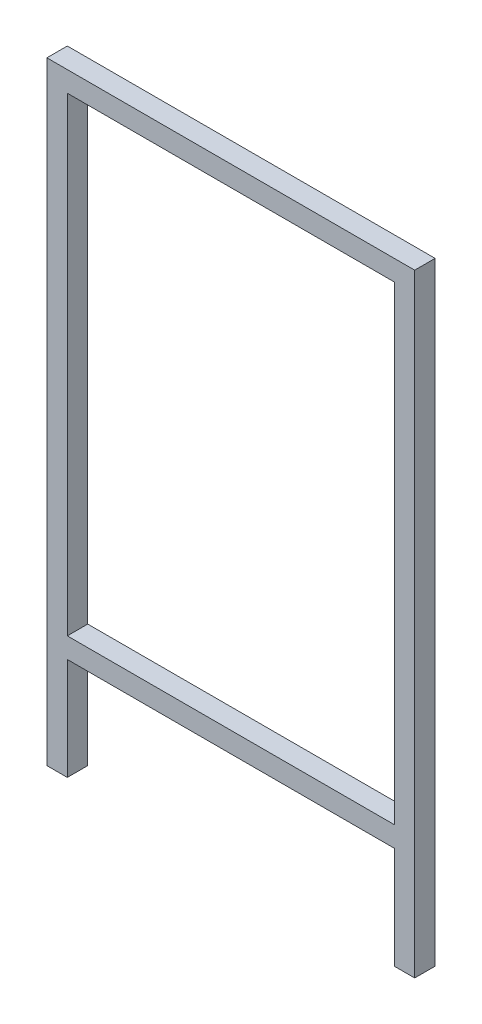
ISO-10303-21;
HEADER;
FILE_DESCRIPTION(('STEP AP214'),'2;1');
FILE_NAME('part.step','',(''),(''),'','','');
FILE_SCHEMA(('AUTOMOTIVE_DESIGN { 1 0 10303 214 1 1 1 1 }'));
ENDSEC;
DATA;
#1=APPLICATION_CONTEXT('core data for automotive mechanical design processes');
#2=APPLICATION_PROTOCOL_DEFINITION('international standard','automotive_design',2000,#1);
#3=PRODUCT_CONTEXT('',#1,'mechanical');
#4=PRODUCT('Part','Part','',(#3));
#5=PRODUCT_RELATED_PRODUCT_CATEGORY('part','',(#4));
#6=PRODUCT_DEFINITION_FORMATION('','',#4);
#7=PRODUCT_DEFINITION_CONTEXT('part definition',#1,'design');
#8=PRODUCT_DEFINITION('design','',#6,#7);
#9=PRODUCT_DEFINITION_SHAPE('','',#8);
#10=(LENGTH_UNIT() NAMED_UNIT(*) SI_UNIT(.MILLI.,.METRE.));
#11=(NAMED_UNIT(*) PLANE_ANGLE_UNIT() SI_UNIT($,.RADIAN.));
#12=(NAMED_UNIT(*) SI_UNIT($,.STERADIAN.) SOLID_ANGLE_UNIT());
#13=UNCERTAINTY_MEASURE_WITH_UNIT(LENGTH_MEASURE(1.E-05),#10,'distance_accuracy_value','');
#14=(GEOMETRIC_REPRESENTATION_CONTEXT(3) GLOBAL_UNCERTAINTY_ASSIGNED_CONTEXT((#13)) GLOBAL_UNIT_ASSIGNED_CONTEXT((#10,
#11,#12)) REPRESENTATION_CONTEXT('',''));
#15=CARTESIAN_POINT('',(0.,0.,0.));
#16=DIRECTION('',(0.,0.,1.));
#17=DIRECTION('',(1.,0.,0.));
#18=AXIS2_PLACEMENT_3D('',#15,#16,#17);
#19=CARTESIAN_POINT('',(0.,0.,10.));
#20=DIRECTION('',(0.,0.,-1.));
#21=DIRECTION('',(-1.,0.,0.));
#22=AXIS2_PLACEMENT_3D('',#19,#20,#21);
#23=PLANE('',#22);
#24=DIRECTION('',(1.,0.,0.));
#25=VECTOR('',#24,1.);
#26=CARTESIAN_POINT('',(-160.,-600.,10.));
#27=LINE('',#26,#25);
#28=CARTESIAN_POINT('',(-180.,-600.,10.));
#29=VERTEX_POINT('',#28);
#30=CARTESIAN_POINT('',(-160.,-600.,10.));
#31=VERTEX_POINT('',#30);
#32=EDGE_CURVE('E158',#29,#31,#27,.T.);
#33=ORIENTED_EDGE('',*,*,#32,.T.);
#34=DIRECTION('',(0.,1.,0.));
#35=VECTOR('',#34,1.);
#36=CARTESIAN_POINT('',(-160.,-500.,10.));
#37=LINE('',#36,#35);
#38=CARTESIAN_POINT('',(-160.,-500.,10.));
#39=VERTEX_POINT('',#38);
#40=EDGE_CURVE('E161',#31,#39,#37,.T.);
#41=ORIENTED_EDGE('',*,*,#40,.T.);
#42=DIRECTION('',(1.,0.,0.));
#43=VECTOR('',#42,1.);
#44=CARTESIAN_POINT('',(160.,-500.,10.));
#45=LINE('',#44,#43);
#46=CARTESIAN_POINT('',(160.,-500.,10.));
#47=VERTEX_POINT('',#46);
#48=EDGE_CURVE('E164',#39,#47,#45,.T.);
#49=ORIENTED_EDGE('',*,*,#48,.T.);
#50=DIRECTION('',(0.,-1.,0.));
#51=VECTOR('',#50,1.);
#52=CARTESIAN_POINT('',(160.,-600.,10.));
#53=LINE('',#52,#51);
#54=CARTESIAN_POINT('',(160.,-600.,10.));
#55=VERTEX_POINT('',#54);
#56=EDGE_CURVE('E166',#47,#55,#53,.T.);
#57=ORIENTED_EDGE('',*,*,#56,.T.);
#58=DIRECTION('',(1.,0.,0.));
#59=VECTOR('',#58,1.);
#60=CARTESIAN_POINT('',(180.,-600.,10.));
#61=LINE('',#60,#59);
#62=CARTESIAN_POINT('',(180.,-600.,10.));
#63=VERTEX_POINT('',#62);
#64=EDGE_CURVE('E168',#55,#63,#61,.T.);
#65=ORIENTED_EDGE('',*,*,#64,.T.);
#66=DIRECTION('',(0.,1.,0.));
#67=VECTOR('',#66,1.);
#68=CARTESIAN_POINT('',(180.,0.,10.));
#69=LINE('',#68,#67);
#70=CARTESIAN_POINT('',(180.,0.,10.));
#71=VERTEX_POINT('',#70);
#72=EDGE_CURVE('E170',#63,#71,#69,.T.);
#73=ORIENTED_EDGE('',*,*,#72,.T.);
#74=DIRECTION('',(-1.,0.,0.));
#75=VECTOR('',#74,1.);
#76=CARTESIAN_POINT('',(-180.,0.,10.));
#77=LINE('',#76,#75);
#78=CARTESIAN_POINT('',(-180.,0.,10.));
#79=VERTEX_POINT('',#78);
#80=EDGE_CURVE('E172',#71,#79,#77,.T.);
#81=ORIENTED_EDGE('',*,*,#80,.T.);
#82=DIRECTION('',(0.,-1.,0.));
#83=VECTOR('',#82,1.);
#84=CARTESIAN_POINT('',(-180.,-600.,10.));
#85=LINE('',#84,#83);
#86=EDGE_CURVE('E174',#79,#29,#85,.T.);
#87=ORIENTED_EDGE('',*,*,#86,.T.);
#88=EDGE_LOOP('',(#33,#41,#49,#57,#65,#73,#81,#87));
#89=FACE_BOUND('',#88,.T.);
#90=DIRECTION('',(0.,-1.,0.));
#91=VECTOR('',#90,1.);
#92=CARTESIAN_POINT('',(-160.,-20.,10.));
#93=LINE('',#92,#91);
#94=CARTESIAN_POINT('',(-160.,-20.,10.));
#95=VERTEX_POINT('',#94);
#96=CARTESIAN_POINT('',(-160.,-480.,10.));
#97=VERTEX_POINT('',#96);
#98=EDGE_CURVE('E122',#95,#97,#93,.T.);
#99=ORIENTED_EDGE('',*,*,#98,.F.);
#100=DIRECTION('',(-1.,0.,0.));
#101=VECTOR('',#100,1.);
#102=CARTESIAN_POINT('',(-160.,-20.,10.));
#103=LINE('',#102,#101);
#104=CARTESIAN_POINT('',(160.,-20.,10.));
#105=VERTEX_POINT('',#104);
#106=EDGE_CURVE('E144',#105,#95,#103,.T.);
#107=ORIENTED_EDGE('',*,*,#106,.F.);
#108=DIRECTION('',(0.,1.,0.));
#109=VECTOR('',#108,1.);
#110=CARTESIAN_POINT('',(160.,-20.,10.));
#111=LINE('',#110,#109);
#112=CARTESIAN_POINT('',(160.,-480.,10.));
#113=VERTEX_POINT('',#112);
#114=EDGE_CURVE('E142',#113,#105,#111,.T.);
#115=ORIENTED_EDGE('',*,*,#114,.F.);
#116=DIRECTION('',(1.,0.,0.));
#117=VECTOR('',#116,1.);
#118=CARTESIAN_POINT('',(-160.,-480.,10.));
#119=LINE('',#118,#117);
#120=EDGE_CURVE('E130',#97,#113,#119,.T.);
#121=ORIENTED_EDGE('',*,*,#120,.F.);
#122=EDGE_LOOP('',(#99,#107,#115,#121));
#123=FACE_BOUND('',#122,.T.);
#124=ADVANCED_FACE('F33',(#89,#123),#23,.F.);
#125=CARTESIAN_POINT('',(0.,0.,-10.));
#126=DIRECTION('',(0.,0.,-1.));
#127=DIRECTION('',(-1.,0.,0.));
#128=AXIS2_PLACEMENT_3D('',#125,#126,#127);
#129=PLANE('',#128);
#130=DIRECTION('',(1.,0.,0.));
#131=VECTOR('',#130,1.);
#132=CARTESIAN_POINT('',(-160.,-600.,-10.));
#133=LINE('',#132,#131);
#134=CARTESIAN_POINT('',(-180.,-600.,-10.));
#135=VERTEX_POINT('',#134);
#136=CARTESIAN_POINT('',(-160.,-600.,-10.));
#137=VERTEX_POINT('',#136);
#138=EDGE_CURVE('E138',#135,#137,#133,.T.);
#139=ORIENTED_EDGE('',*,*,#138,.F.);
#140=DIRECTION('',(0.,-1.,0.));
#141=VECTOR('',#140,1.);
#142=CARTESIAN_POINT('',(-180.,-600.,-10.));
#143=LINE('',#142,#141);
#144=CARTESIAN_POINT('',(-180.,0.,-10.));
#145=VERTEX_POINT('',#144);
#146=EDGE_CURVE('E162',#145,#135,#143,.T.);
#147=ORIENTED_EDGE('',*,*,#146,.F.);
#148=DIRECTION('',(-1.,0.,0.));
#149=VECTOR('',#148,1.);
#150=CARTESIAN_POINT('',(-180.,0.,-10.));
#151=LINE('',#150,#149);
#152=CARTESIAN_POINT('',(180.,0.,-10.));
#153=VERTEX_POINT('',#152);
#154=EDGE_CURVE('E189',#153,#145,#151,.T.);
#155=ORIENTED_EDGE('',*,*,#154,.F.);
#156=DIRECTION('',(0.,1.,0.));
#157=VECTOR('',#156,1.);
#158=CARTESIAN_POINT('',(180.,0.,-10.));
#159=LINE('',#158,#157);
#160=CARTESIAN_POINT('',(180.,-600.,-10.));
#161=VERTEX_POINT('',#160);
#162=EDGE_CURVE('E187',#161,#153,#159,.T.);
#163=ORIENTED_EDGE('',*,*,#162,.F.);
#164=DIRECTION('',(1.,0.,0.));
#165=VECTOR('',#164,1.);
#166=CARTESIAN_POINT('',(180.,-600.,-10.));
#167=LINE('',#166,#165);
#168=CARTESIAN_POINT('',(160.,-600.,-10.));
#169=VERTEX_POINT('',#168);
#170=EDGE_CURVE('E185',#169,#161,#167,.T.);
#171=ORIENTED_EDGE('',*,*,#170,.F.);
#172=DIRECTION('',(0.,-1.,0.));
#173=VECTOR('',#172,1.);
#174=CARTESIAN_POINT('',(160.,-600.,-10.));
#175=LINE('',#174,#173);
#176=CARTESIAN_POINT('',(160.,-500.,-10.));
#177=VERTEX_POINT('',#176);
#178=EDGE_CURVE('E183',#177,#169,#175,.T.);
#179=ORIENTED_EDGE('',*,*,#178,.F.);
#180=DIRECTION('',(1.,0.,0.));
#181=VECTOR('',#180,1.);
#182=CARTESIAN_POINT('',(160.,-500.,-10.));
#183=LINE('',#182,#181);
#184=CARTESIAN_POINT('',(-160.,-500.,-10.));
#185=VERTEX_POINT('',#184);
#186=EDGE_CURVE('E181',#185,#177,#183,.T.);
#187=ORIENTED_EDGE('',*,*,#186,.F.);
#188=DIRECTION('',(0.,1.,0.));
#189=VECTOR('',#188,1.);
#190=CARTESIAN_POINT('',(-160.,-500.,-10.));
#191=LINE('',#190,#189);
#192=EDGE_CURVE('E179',#137,#185,#191,.T.);
#193=ORIENTED_EDGE('',*,*,#192,.F.);
#194=EDGE_LOOP('',(#139,#147,#155,#163,#171,#179,#187,#193));
#195=FACE_BOUND('',#194,.T.);
#196=DIRECTION('',(-1.,0.,0.));
#197=VECTOR('',#196,1.);
#198=CARTESIAN_POINT('',(-160.,-20.,-10.));
#199=LINE('',#198,#197);
#200=CARTESIAN_POINT('',(160.,-20.,-10.));
#201=VERTEX_POINT('',#200);
#202=CARTESIAN_POINT('',(-160.,-20.,-10.));
#203=VERTEX_POINT('',#202);
#204=EDGE_CURVE('E131',#201,#203,#199,.T.);
#205=ORIENTED_EDGE('',*,*,#204,.T.);
#206=DIRECTION('',(0.,-1.,0.));
#207=VECTOR('',#206,1.);
#208=CARTESIAN_POINT('',(-160.,-20.,-10.));
#209=LINE('',#208,#207);
#210=CARTESIAN_POINT('',(-160.,-480.,-10.));
#211=VERTEX_POINT('',#210);
#212=EDGE_CURVE('E56',#203,#211,#209,.T.);
#213=ORIENTED_EDGE('',*,*,#212,.T.);
#214=DIRECTION('',(1.,0.,0.));
#215=VECTOR('',#214,1.);
#216=CARTESIAN_POINT('',(-160.,-480.,-10.));
#217=LINE('',#216,#215);
#218=CARTESIAN_POINT('',(160.,-480.,-10.));
#219=VERTEX_POINT('',#218);
#220=EDGE_CURVE('E137',#211,#219,#217,.T.);
#221=ORIENTED_EDGE('',*,*,#220,.T.);
#222=DIRECTION('',(0.,1.,0.));
#223=VECTOR('',#222,1.);
#224=CARTESIAN_POINT('',(160.,-20.,-10.));
#225=LINE('',#224,#223);
#226=EDGE_CURVE('E150',#219,#201,#225,.T.);
#227=ORIENTED_EDGE('',*,*,#226,.T.);
#228=EDGE_LOOP('',(#205,#213,#221,#227));
#229=FACE_BOUND('',#228,.T.);
#230=ADVANCED_FACE('F219',(#195,#229),#129,.T.);
#231=CARTESIAN_POINT('',(-160.,-600.,10.));
#232=DIRECTION('',(0.,1.,0.));
#233=DIRECTION('',(0.,0.,1.));
#234=AXIS2_PLACEMENT_3D('',#231,#232,#233);
#235=PLANE('',#234);
#236=ORIENTED_EDGE('',*,*,#138,.T.);
#237=DIRECTION('',(0.,0.,-1.));
#238=VECTOR('',#237,1.);
#239=CARTESIAN_POINT('',(-160.,-600.,10.));
#240=LINE('',#239,#238);
#241=EDGE_CURVE('E11',#31,#137,#240,.T.);
#242=ORIENTED_EDGE('',*,*,#241,.F.);
#243=ORIENTED_EDGE('',*,*,#32,.F.);
#244=DIRECTION('',(0.,0.,-1.));
#245=VECTOR('',#244,1.);
#246=CARTESIAN_POINT('',(-180.,-600.,10.));
#247=LINE('',#246,#245);
#248=EDGE_CURVE('E176',#29,#135,#247,.T.);
#249=ORIENTED_EDGE('',*,*,#248,.T.);
#250=EDGE_LOOP('',(#236,#242,#243,#249));
#251=FACE_BOUND('',#250,.T.);
#252=ADVANCED_FACE('F35',(#251),#235,.F.);
#253=CARTESIAN_POINT('',(-160.,-500.,10.));
#254=DIRECTION('',(-1.,0.,0.));
#255=DIRECTION('',(0.,-1.,0.));
#256=AXIS2_PLACEMENT_3D('',#253,#254,#255);
#257=PLANE('',#256);
#258=ORIENTED_EDGE('',*,*,#192,.T.);
#259=DIRECTION('',(0.,0.,-1.));
#260=VECTOR('',#259,1.);
#261=CARTESIAN_POINT('',(-160.,-500.,10.));
#262=LINE('',#261,#260);
#263=EDGE_CURVE('E41',#39,#185,#262,.T.);
#264=ORIENTED_EDGE('',*,*,#263,.F.);
#265=ORIENTED_EDGE('',*,*,#40,.F.);
#266=ORIENTED_EDGE('',*,*,#241,.T.);
#267=EDGE_LOOP('',(#258,#264,#265,#266));
#268=FACE_BOUND('',#267,.T.);
#269=ADVANCED_FACE('F236',(#268),#257,.F.);
#270=CARTESIAN_POINT('',(160.,-500.,10.));
#271=DIRECTION('',(0.,1.,0.));
#272=DIRECTION('',(0.,0.,1.));
#273=AXIS2_PLACEMENT_3D('',#270,#271,#272);
#274=PLANE('',#273);
#275=ORIENTED_EDGE('',*,*,#186,.T.);
#276=DIRECTION('',(0.,0.,-1.));
#277=VECTOR('',#276,1.);
#278=CARTESIAN_POINT('',(160.,-500.,10.));
#279=LINE('',#278,#277);
#280=EDGE_CURVE('E206',#47,#177,#279,.T.);
#281=ORIENTED_EDGE('',*,*,#280,.F.);
#282=ORIENTED_EDGE('',*,*,#48,.F.);
#283=ORIENTED_EDGE('',*,*,#263,.T.);
#284=EDGE_LOOP('',(#275,#281,#282,#283));
#285=FACE_BOUND('',#284,.T.);
#286=ADVANCED_FACE('F213',(#285),#274,.F.);
#287=CARTESIAN_POINT('',(160.,-600.,10.));
#288=DIRECTION('',(1.,0.,0.));
#289=DIRECTION('',(0.,1.,0.));
#290=AXIS2_PLACEMENT_3D('',#287,#288,#289);
#291=PLANE('',#290);
#292=ORIENTED_EDGE('',*,*,#178,.T.);
#293=DIRECTION('',(0.,0.,-1.));
#294=VECTOR('',#293,1.);
#295=CARTESIAN_POINT('',(160.,-600.,10.));
#296=LINE('',#295,#294);
#297=EDGE_CURVE('E203',#55,#169,#296,.T.);
#298=ORIENTED_EDGE('',*,*,#297,.F.);
#299=ORIENTED_EDGE('',*,*,#56,.F.);
#300=ORIENTED_EDGE('',*,*,#280,.T.);
#301=EDGE_LOOP('',(#292,#298,#299,#300));
#302=FACE_BOUND('',#301,.T.);
#303=ADVANCED_FACE('F225',(#302),#291,.F.);
#304=CARTESIAN_POINT('',(180.,-600.,10.));
#305=DIRECTION('',(0.,1.,0.));
#306=DIRECTION('',(0.,0.,1.));
#307=AXIS2_PLACEMENT_3D('',#304,#305,#306);
#308=PLANE('',#307);
#309=ORIENTED_EDGE('',*,*,#170,.T.);
#310=DIRECTION('',(0.,0.,-1.));
#311=VECTOR('',#310,1.);
#312=CARTESIAN_POINT('',(180.,-600.,10.));
#313=LINE('',#312,#311);
#314=EDGE_CURVE('E200',#63,#161,#313,.T.);
#315=ORIENTED_EDGE('',*,*,#314,.F.);
#316=ORIENTED_EDGE('',*,*,#64,.F.);
#317=ORIENTED_EDGE('',*,*,#297,.T.);
#318=EDGE_LOOP('',(#309,#315,#316,#317));
#319=FACE_BOUND('',#318,.T.);
#320=ADVANCED_FACE('F229',(#319),#308,.F.);
#321=CARTESIAN_POINT('',(180.,0.,10.));
#322=DIRECTION('',(-1.,0.,0.));
#323=DIRECTION('',(0.,0.,1.));
#324=AXIS2_PLACEMENT_3D('',#321,#322,#323);
#325=PLANE('',#324);
#326=ORIENTED_EDGE('',*,*,#162,.T.);
#327=DIRECTION('',(0.,0.,-1.));
#328=VECTOR('',#327,1.);
#329=CARTESIAN_POINT('',(180.,0.,10.));
#330=LINE('',#329,#328);
#331=EDGE_CURVE('E197',#71,#153,#330,.T.);
#332=ORIENTED_EDGE('',*,*,#331,.F.);
#333=ORIENTED_EDGE('',*,*,#72,.F.);
#334=ORIENTED_EDGE('',*,*,#314,.T.);
#335=EDGE_LOOP('',(#326,#332,#333,#334));
#336=FACE_BOUND('',#335,.T.);
#337=ADVANCED_FACE('F249',(#336),#325,.F.);
#338=CARTESIAN_POINT('',(-180.,0.,10.));
#339=DIRECTION('',(0.,-1.,0.));
#340=DIRECTION('',(0.,0.,-1.));
#341=AXIS2_PLACEMENT_3D('',#338,#339,#340);
#342=PLANE('',#341);
#343=ORIENTED_EDGE('',*,*,#154,.T.);
#344=DIRECTION('',(0.,0.,-1.));
#345=VECTOR('',#344,1.);
#346=CARTESIAN_POINT('',(-180.,0.,10.));
#347=LINE('',#346,#345);
#348=EDGE_CURVE('E194',#79,#145,#347,.T.);
#349=ORIENTED_EDGE('',*,*,#348,.F.);
#350=ORIENTED_EDGE('',*,*,#80,.F.);
#351=ORIENTED_EDGE('',*,*,#331,.T.);
#352=EDGE_LOOP('',(#343,#349,#350,#351));
#353=FACE_BOUND('',#352,.T.);
#354=ADVANCED_FACE('F247',(#353),#342,.F.);
#355=CARTESIAN_POINT('',(-180.,-600.,10.));
#356=DIRECTION('',(1.,0.,0.));
#357=DIRECTION('',(0.,1.,0.));
#358=AXIS2_PLACEMENT_3D('',#355,#356,#357);
#359=PLANE('',#358);
#360=ORIENTED_EDGE('',*,*,#146,.T.);
#361=ORIENTED_EDGE('',*,*,#248,.F.);
#362=ORIENTED_EDGE('',*,*,#86,.F.);
#363=ORIENTED_EDGE('',*,*,#348,.T.);
#364=EDGE_LOOP('',(#360,#361,#362,#363));
#365=FACE_BOUND('',#364,.T.);
#366=ADVANCED_FACE('F242',(#365),#359,.F.);
#367=CARTESIAN_POINT('',(-160.,-20.,10.));
#368=DIRECTION('',(1.,0.,0.));
#369=DIRECTION('',(0.,0.,-1.));
#370=AXIS2_PLACEMENT_3D('',#367,#368,#369);
#371=PLANE('',#370);
#372=ORIENTED_EDGE('',*,*,#212,.F.);
#373=DIRECTION('',(0.,0.,-1.));
#374=VECTOR('',#373,1.);
#375=CARTESIAN_POINT('',(-160.,-20.,10.));
#376=LINE('',#375,#374);
#377=EDGE_CURVE('E126',#95,#203,#376,.T.);
#378=ORIENTED_EDGE('',*,*,#377,.F.);
#379=ORIENTED_EDGE('',*,*,#98,.T.);
#380=DIRECTION('',(0.,0.,-1.));
#381=VECTOR('',#380,1.);
#382=CARTESIAN_POINT('',(-160.,-480.,10.));
#383=LINE('',#382,#381);
#384=EDGE_CURVE('E125',#97,#211,#383,.T.);
#385=ORIENTED_EDGE('',*,*,#384,.T.);
#386=EDGE_LOOP('',(#372,#378,#379,#385));
#387=FACE_BOUND('',#386,.T.);
#388=ADVANCED_FACE('F124',(#387),#371,.T.);
#389=CARTESIAN_POINT('',(-160.,-480.,10.));
#390=DIRECTION('',(0.,1.,0.));
#391=DIRECTION('',(0.,0.,1.));
#392=AXIS2_PLACEMENT_3D('',#389,#390,#391);
#393=PLANE('',#392);
#394=ORIENTED_EDGE('',*,*,#220,.F.);
#395=ORIENTED_EDGE('',*,*,#384,.F.);
#396=ORIENTED_EDGE('',*,*,#120,.T.);
#397=DIRECTION('',(0.,0.,-1.));
#398=VECTOR('',#397,1.);
#399=CARTESIAN_POINT('',(160.,-480.,10.));
#400=LINE('',#399,#398);
#401=EDGE_CURVE('E139',#113,#219,#400,.T.);
#402=ORIENTED_EDGE('',*,*,#401,.T.);
#403=EDGE_LOOP('',(#394,#395,#396,#402));
#404=FACE_BOUND('',#403,.T.);
#405=ADVANCED_FACE('F134',(#404),#393,.T.);
#406=CARTESIAN_POINT('',(160.,-20.,10.));
#407=DIRECTION('',(-1.,0.,0.));
#408=DIRECTION('',(0.,-1.,0.));
#409=AXIS2_PLACEMENT_3D('',#406,#407,#408);
#410=PLANE('',#409);
#411=ORIENTED_EDGE('',*,*,#226,.F.);
#412=ORIENTED_EDGE('',*,*,#401,.F.);
#413=ORIENTED_EDGE('',*,*,#114,.T.);
#414=DIRECTION('',(0.,0.,-1.));
#415=VECTOR('',#414,1.);
#416=CARTESIAN_POINT('',(160.,-20.,10.));
#417=LINE('',#416,#415);
#418=EDGE_CURVE('E48',#105,#201,#417,.T.);
#419=ORIENTED_EDGE('',*,*,#418,.T.);
#420=EDGE_LOOP('',(#411,#412,#413,#419));
#421=FACE_BOUND('',#420,.T.);
#422=ADVANCED_FACE('F274',(#421),#410,.T.);
#423=CARTESIAN_POINT('',(-160.,-20.,10.));
#424=DIRECTION('',(0.,-1.,0.));
#425=DIRECTION('',(1.,0.,0.));
#426=AXIS2_PLACEMENT_3D('',#423,#424,#425);
#427=PLANE('',#426);
#428=ORIENTED_EDGE('',*,*,#204,.F.);
#429=ORIENTED_EDGE('',*,*,#418,.F.);
#430=ORIENTED_EDGE('',*,*,#106,.T.);
#431=ORIENTED_EDGE('',*,*,#377,.T.);
#432=EDGE_LOOP('',(#428,#429,#430,#431));
#433=FACE_BOUND('',#432,.T.);
#434=ADVANCED_FACE('F278',(#433),#427,.T.);
#435=CLOSED_SHELL('',(#124,#230,#252,#269,#286,#303,#320,#337,#354,#366,#388,#405,#422,#434));
#436=MANIFOLD_SOLID_BREP('B2',#435);
#437=ADVANCED_BREP_SHAPE_REPRESENTATION('',(#18,#436),#14);
#438=SHAPE_DEFINITION_REPRESENTATION(#9,#437);
ENDSEC;
END-ISO-10303-21;
